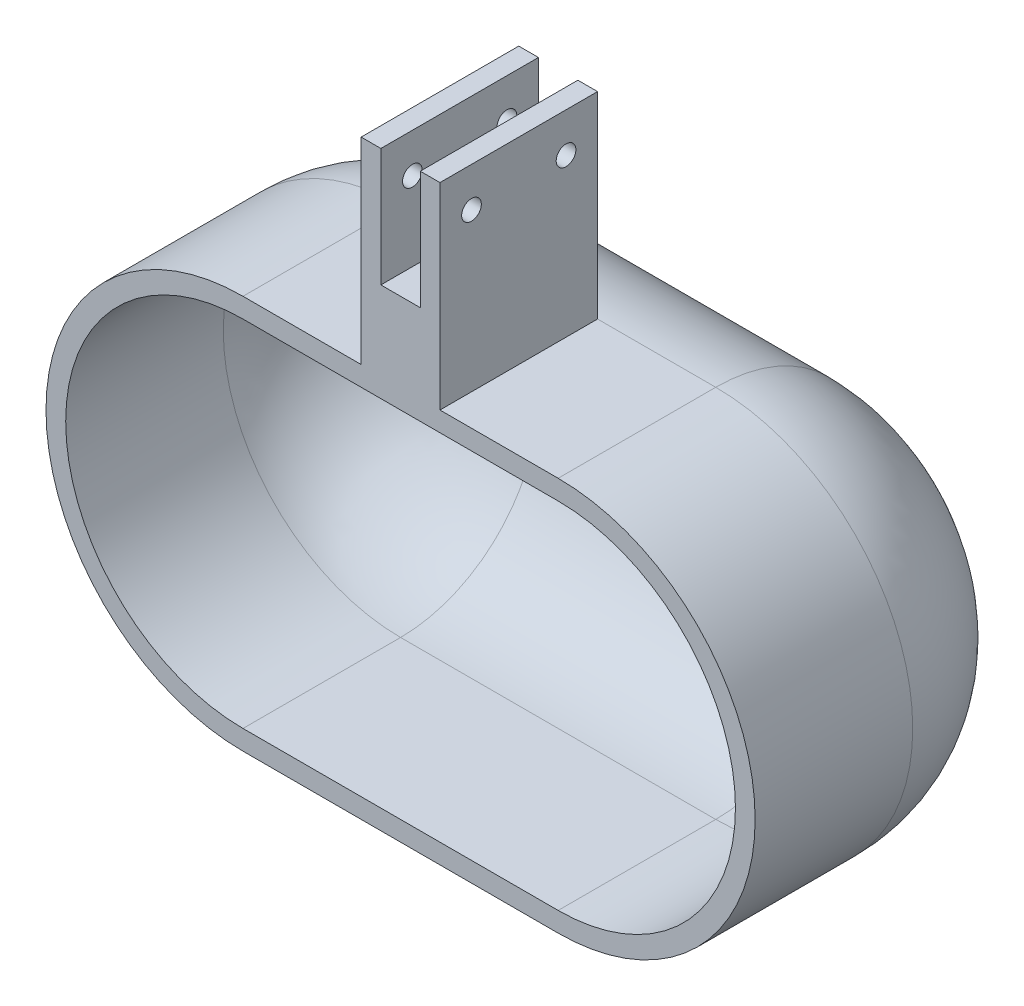
ISO-10303-21;
HEADER;
FILE_DESCRIPTION(('STEP AP214'),'2;1');
FILE_NAME('part.step','',(''),(''),'','','');
FILE_SCHEMA(('AUTOMOTIVE_DESIGN { 1 0 10303 214 1 1 1 1 }'));
ENDSEC;
DATA;
#1=APPLICATION_CONTEXT('core data for automotive mechanical design processes');
#2=APPLICATION_PROTOCOL_DEFINITION('international standard','automotive_design',2000,#1);
#3=PRODUCT_CONTEXT('',#1,'mechanical');
#4=PRODUCT('Part','Part','',(#3));
#5=PRODUCT_RELATED_PRODUCT_CATEGORY('part','',(#4));
#6=PRODUCT_DEFINITION_FORMATION('','',#4);
#7=PRODUCT_DEFINITION_CONTEXT('part definition',#1,'design');
#8=PRODUCT_DEFINITION('design','',#6,#7);
#9=PRODUCT_DEFINITION_SHAPE('','',#8);
#10=(LENGTH_UNIT() NAMED_UNIT(*) SI_UNIT(.MILLI.,.METRE.));
#11=(NAMED_UNIT(*) PLANE_ANGLE_UNIT() SI_UNIT($,.RADIAN.));
#12=(NAMED_UNIT(*) SI_UNIT($,.STERADIAN.) SOLID_ANGLE_UNIT());
#13=UNCERTAINTY_MEASURE_WITH_UNIT(LENGTH_MEASURE(1.E-05),#10,'distance_accuracy_value','');
#14=(GEOMETRIC_REPRESENTATION_CONTEXT(3) GLOBAL_UNCERTAINTY_ASSIGNED_CONTEXT((#13)) GLOBAL_UNIT_ASSIGNED_CONTEXT((#10,
#11,#12)) REPRESENTATION_CONTEXT('',''));
#15=CARTESIAN_POINT('',(0.,0.,0.));
#16=DIRECTION('',(0.,0.,1.));
#17=DIRECTION('',(1.,0.,0.));
#18=AXIS2_PLACEMENT_3D('',#15,#16,#17);
#19=CARTESIAN_POINT('',(0.,0.,80.));
#20=DIRECTION('',(0.,0.,1.));
#21=DIRECTION('',(1.,0.,0.));
#22=AXIS2_PLACEMENT_3D('',#19,#20,#21);
#23=PLANE('',#22);
#24=CARTESIAN_POINT('',(0.,0.,80.));
#25=DIRECTION('',(0.,0.,1.));
#26=DIRECTION('',(1.,0.,0.));
#27=AXIS2_PLACEMENT_3D('',#24,#25,#26);
#28=CIRCLE('',#27,45.);
#29=CARTESIAN_POINT('',(0.,-45.,80.));
#30=VERTEX_POINT('',#29);
#31=CARTESIAN_POINT('',(0.,45.,80.));
#32=VERTEX_POINT('',#31);
#33=EDGE_CURVE('E276',#30,#32,#28,.T.);
#34=ORIENTED_EDGE('',*,*,#33,.F.);
#35=DIRECTION('',(1.,0.,0.));
#36=VECTOR('',#35,1.);
#37=CARTESIAN_POINT('',(0.,-45.,80.));
#38=LINE('',#37,#36);
#39=CARTESIAN_POINT('',(-80.,-45.,80.));
#40=VERTEX_POINT('',#39);
#41=EDGE_CURVE('E245',#40,#30,#38,.T.);
#42=ORIENTED_EDGE('',*,*,#41,.F.);
#43=CARTESIAN_POINT('',(-80.,0.,80.));
#44=DIRECTION('',(0.,0.,1.));
#45=DIRECTION('',(1.,0.,0.));
#46=AXIS2_PLACEMENT_3D('',#43,#44,#45);
#47=CIRCLE('',#46,45.);
#48=CARTESIAN_POINT('',(-80.,45.,80.));
#49=VERTEX_POINT('',#48);
#50=EDGE_CURVE('E286',#49,#40,#47,.T.);
#51=ORIENTED_EDGE('',*,*,#50,.F.);
#52=DIRECTION('',(-1.,0.,0.));
#53=VECTOR('',#52,1.);
#54=CARTESIAN_POINT('',(0.,45.,80.));
#55=LINE('',#54,#53);
#56=EDGE_CURVE('E284',#32,#49,#55,.T.);
#57=ORIENTED_EDGE('',*,*,#56,.F.);
#58=EDGE_LOOP('',(#34,#42,#51,#57));
#59=FACE_BOUND('',#58,.T.);
#60=DIRECTION('',(-1.,0.,0.));
#61=VECTOR('',#60,1.);
#62=CARTESIAN_POINT('',(-35.,70.,80.));
#63=LINE('',#62,#61);
#64=CARTESIAN_POINT('',(-35.,70.,80.));
#65=VERTEX_POINT('',#64);
#66=CARTESIAN_POINT('',(-45.,70.,80.));
#67=VERTEX_POINT('',#66);
#68=EDGE_CURVE('E192',#65,#67,#63,.T.);
#69=ORIENTED_EDGE('',*,*,#68,.T.);
#70=DIRECTION('',(0.,-1.,0.));
#71=VECTOR('',#70,1.);
#72=CARTESIAN_POINT('',(-45.,100.000012,80.));
#73=LINE('',#72,#71);
#74=CARTESIAN_POINT('',(-45.,100.,80.));
#75=VERTEX_POINT('',#74);
#76=EDGE_CURVE('E177',#75,#67,#73,.T.);
#77=ORIENTED_EDGE('',*,*,#76,.F.);
#78=DIRECTION('',(1.,0.,0.));
#79=VECTOR('',#78,1.);
#80=CARTESIAN_POINT('',(-30.,100.,80.));
#81=LINE('',#80,#79);
#82=CARTESIAN_POINT('',(-50.,100.,80.));
#83=VERTEX_POINT('',#82);
#84=EDGE_CURVE('E220',#83,#75,#81,.T.);
#85=ORIENTED_EDGE('',*,*,#84,.F.);
#86=DIRECTION('',(0.,-1.,0.));
#87=VECTOR('',#86,1.);
#88=CARTESIAN_POINT('',(-50.,100.,80.));
#89=LINE('',#88,#87);
#90=CARTESIAN_POINT('',(-50.,50.,80.));
#91=VERTEX_POINT('',#90);
#92=EDGE_CURVE('E231',#83,#91,#89,.T.);
#93=ORIENTED_EDGE('',*,*,#92,.T.);
#94=DIRECTION('',(-1.,0.,0.));
#95=VECTOR('',#94,1.);
#96=CARTESIAN_POINT('',(0.,50.,80.));
#97=LINE('',#96,#95);
#98=CARTESIAN_POINT('',(-80.,50.,80.));
#99=VERTEX_POINT('',#98);
#100=EDGE_CURVE('E62',#91,#99,#97,.T.);
#101=ORIENTED_EDGE('',*,*,#100,.T.);
#102=CARTESIAN_POINT('',(-80.,0.,80.));
#103=DIRECTION('',(0.,0.,1.));
#104=DIRECTION('',(1.,0.,0.));
#105=AXIS2_PLACEMENT_3D('',#102,#103,#104);
#106=CIRCLE('',#105,50.);
#107=CARTESIAN_POINT('',(-80.,-50.,80.));
#108=VERTEX_POINT('',#107);
#109=EDGE_CURVE('E297',#99,#108,#106,.T.);
#110=ORIENTED_EDGE('',*,*,#109,.T.);
#111=DIRECTION('',(1.,0.,0.));
#112=VECTOR('',#111,1.);
#113=CARTESIAN_POINT('',(0.,-50.,80.));
#114=LINE('',#113,#112);
#115=CARTESIAN_POINT('',(0.,-50.,80.));
#116=VERTEX_POINT('',#115);
#117=EDGE_CURVE('E299',#108,#116,#114,.T.);
#118=ORIENTED_EDGE('',*,*,#117,.T.);
#119=CARTESIAN_POINT('',(0.,0.,80.));
#120=DIRECTION('',(0.,0.,1.));
#121=DIRECTION('',(1.,0.,0.));
#122=AXIS2_PLACEMENT_3D('',#119,#120,#121);
#123=CIRCLE('',#122,50.);
#124=CARTESIAN_POINT('',(0.,50.,80.));
#125=VERTEX_POINT('',#124);
#126=EDGE_CURVE('E290',#116,#125,#123,.T.);
#127=ORIENTED_EDGE('',*,*,#126,.T.);
#128=CARTESIAN_POINT('',(-30.,50.,80.));
#129=VERTEX_POINT('',#128);
#130=EDGE_CURVE('E294',#125,#129,#97,.T.);
#131=ORIENTED_EDGE('',*,*,#130,.T.);
#132=DIRECTION('',(0.,-1.,0.));
#133=VECTOR('',#132,1.);
#134=CARTESIAN_POINT('',(-30.,100.,80.));
#135=LINE('',#134,#133);
#136=CARTESIAN_POINT('',(-30.,100.,80.));
#137=VERTEX_POINT('',#136);
#138=EDGE_CURVE('E222',#137,#129,#135,.T.);
#139=ORIENTED_EDGE('',*,*,#138,.F.);
#140=CARTESIAN_POINT('',(-35.,100.,80.));
#141=VERTEX_POINT('',#140);
#142=EDGE_CURVE('E219',#141,#137,#81,.T.);
#143=ORIENTED_EDGE('',*,*,#142,.F.);
#144=DIRECTION('',(0.,-1.,0.));
#145=VECTOR('',#144,1.);
#146=CARTESIAN_POINT('',(-35.,100.000012,80.));
#147=LINE('',#146,#145);
#148=EDGE_CURVE('E54',#141,#65,#147,.T.);
#149=ORIENTED_EDGE('',*,*,#148,.T.);
#150=EDGE_LOOP('',(#69,#77,#85,#93,#101,#110,#118,#127,#131,#139,#143,#149));
#151=FACE_BOUND('',#150,.T.);
#152=ADVANCED_FACE('F37',(#59,#151),#23,.T.);
#153=CARTESIAN_POINT('',(-30.,100.,40.));
#154=DIRECTION('',(0.,0.,1.));
#155=DIRECTION('',(1.,0.,0.));
#156=AXIS2_PLACEMENT_3D('',#153,#154,#155);
#157=PLANE('',#156);
#158=DIRECTION('',(0.,-1.,0.));
#159=VECTOR('',#158,1.);
#160=CARTESIAN_POINT('',(-45.,100.000012,40.));
#161=LINE('',#160,#159);
#162=CARTESIAN_POINT('',(-45.,100.,40.));
#163=VERTEX_POINT('',#162);
#164=CARTESIAN_POINT('',(-45.,70.,40.));
#165=VERTEX_POINT('',#164);
#166=EDGE_CURVE('E204',#163,#165,#161,.T.);
#167=ORIENTED_EDGE('',*,*,#166,.T.);
#168=DIRECTION('',(1.,0.,0.));
#169=VECTOR('',#168,1.);
#170=CARTESIAN_POINT('',(-45.,70.,40.));
#171=LINE('',#170,#169);
#172=CARTESIAN_POINT('',(-35.,70.,40.));
#173=VERTEX_POINT('',#172);
#174=EDGE_CURVE('E194',#165,#173,#171,.T.);
#175=ORIENTED_EDGE('',*,*,#174,.T.);
#176=DIRECTION('',(0.,-1.,0.));
#177=VECTOR('',#176,1.);
#178=CARTESIAN_POINT('',(-35.,100.000012,40.));
#179=LINE('',#178,#177);
#180=CARTESIAN_POINT('',(-35.,100.,40.));
#181=VERTEX_POINT('',#180);
#182=EDGE_CURVE('E206',#181,#173,#179,.T.);
#183=ORIENTED_EDGE('',*,*,#182,.F.);
#184=DIRECTION('',(-1.,0.,0.));
#185=VECTOR('',#184,1.);
#186=CARTESIAN_POINT('',(-30.,100.,40.));
#187=LINE('',#186,#185);
#188=CARTESIAN_POINT('',(-30.,100.,40.));
#189=VERTEX_POINT('',#188);
#190=EDGE_CURVE('E214',#189,#181,#187,.T.);
#191=ORIENTED_EDGE('',*,*,#190,.F.);
#192=DIRECTION('',(0.,-1.,0.));
#193=VECTOR('',#192,1.);
#194=CARTESIAN_POINT('',(-30.,100.,40.));
#195=LINE('',#194,#193);
#196=CARTESIAN_POINT('',(-30.,50.,40.));
#197=VERTEX_POINT('',#196);
#198=EDGE_CURVE('E237',#189,#197,#195,.T.);
#199=ORIENTED_EDGE('',*,*,#198,.T.);
#200=DIRECTION('',(-1.,0.,0.));
#201=VECTOR('',#200,1.);
#202=CARTESIAN_POINT('',(-30.,50.,40.));
#203=LINE('',#202,#201);
#204=CARTESIAN_POINT('',(-50.,50.,40.));
#205=VERTEX_POINT('',#204);
#206=EDGE_CURVE('E225',#197,#205,#203,.T.);
#207=ORIENTED_EDGE('',*,*,#206,.T.);
#208=DIRECTION('',(0.,-1.,0.));
#209=VECTOR('',#208,1.);
#210=CARTESIAN_POINT('',(-50.,100.,40.));
#211=LINE('',#210,#209);
#212=CARTESIAN_POINT('',(-50.,100.,40.));
#213=VERTEX_POINT('',#212);
#214=EDGE_CURVE('E234',#213,#205,#211,.T.);
#215=ORIENTED_EDGE('',*,*,#214,.F.);
#216=EDGE_CURVE('E212',#163,#213,#187,.T.);
#217=ORIENTED_EDGE('',*,*,#216,.F.);
#218=EDGE_LOOP('',(#167,#175,#183,#191,#199,#207,#215,#217));
#219=FACE_BOUND('',#218,.T.);
#220=ADVANCED_FACE('F382',(#219),#157,.F.);
#221=CARTESIAN_POINT('',(0.,100.,0.));
#222=DIRECTION('',(0.,1.,0.));
#223=DIRECTION('',(-1.,0.,0.));
#224=AXIS2_PLACEMENT_3D('',#221,#222,#223);
#225=PLANE('',#224);
#226=ORIENTED_EDGE('',*,*,#84,.T.);
#227=DIRECTION('',(0.,0.,-1.));
#228=VECTOR('',#227,1.);
#229=CARTESIAN_POINT('',(-45.,100.,0.));
#230=LINE('',#229,#228);
#231=EDGE_CURVE('E11',#75,#163,#230,.T.);
#232=ORIENTED_EDGE('',*,*,#231,.T.);
#233=ORIENTED_EDGE('',*,*,#216,.T.);
#234=DIRECTION('',(0.,0.,1.));
#235=VECTOR('',#234,1.);
#236=CARTESIAN_POINT('',(-50.,100.,80.));
#237=LINE('',#236,#235);
#238=EDGE_CURVE('E217',#213,#83,#237,.T.);
#239=ORIENTED_EDGE('',*,*,#238,.T.);
#240=EDGE_LOOP('',(#226,#232,#233,#239));
#241=FACE_BOUND('',#240,.T.);
#242=ADVANCED_FACE('F388',(#241),#225,.T.);
#243=CARTESIAN_POINT('',(0.,50.,80.));
#244=DIRECTION('',(0.,-1.,0.));
#245=DIRECTION('',(1.,0.,0.));
#246=AXIS2_PLACEMENT_3D('',#243,#244,#245);
#247=PLANE('',#246);
#248=DIRECTION('',(0.,0.,-1.));
#249=VECTOR('',#248,1.);
#250=CARTESIAN_POINT('',(-30.,50.,80.));
#251=LINE('',#250,#249);
#252=EDGE_CURVE('E186',#129,#197,#251,.T.);
#253=ORIENTED_EDGE('',*,*,#252,.F.);
#254=ORIENTED_EDGE('',*,*,#130,.F.);
#255=DIRECTION('',(0.,0.,-1.));
#256=VECTOR('',#255,1.);
#257=CARTESIAN_POINT('',(0.,50.,80.));
#258=LINE('',#257,#256);
#259=CARTESIAN_POINT('',(0.,50.,40.));
#260=VERTEX_POINT('',#259);
#261=EDGE_CURVE('E310',#125,#260,#258,.T.);
#262=ORIENTED_EDGE('',*,*,#261,.T.);
#263=DIRECTION('',(-1.,0.,0.));
#264=VECTOR('',#263,1.);
#265=CARTESIAN_POINT('',(0.,50.,40.));
#266=LINE('',#265,#264);
#267=EDGE_CURVE('E314',#260,#197,#266,.T.);
#268=ORIENTED_EDGE('',*,*,#267,.T.);
#269=EDGE_LOOP('',(#253,#254,#262,#268));
#270=FACE_BOUND('',#269,.T.);
#271=ADVANCED_FACE('F409',(#270),#247,.F.);
#272=DIRECTION('',(0.,0.,1.));
#273=VECTOR('',#272,1.);
#274=CARTESIAN_POINT('',(-50.,50.,80.));
#275=LINE('',#274,#273);
#276=EDGE_CURVE('E213',#205,#91,#275,.T.);
#277=ORIENTED_EDGE('',*,*,#276,.F.);
#278=CARTESIAN_POINT('',(-80.,50.,40.));
#279=VERTEX_POINT('',#278);
#280=EDGE_CURVE('E313',#205,#279,#266,.T.);
#281=ORIENTED_EDGE('',*,*,#280,.T.);
#282=DIRECTION('',(0.,0.,-1.));
#283=VECTOR('',#282,1.);
#284=CARTESIAN_POINT('',(-80.,50.,80.));
#285=LINE('',#284,#283);
#286=EDGE_CURVE('E307',#99,#279,#285,.T.);
#287=ORIENTED_EDGE('',*,*,#286,.F.);
#288=ORIENTED_EDGE('',*,*,#100,.F.);
#289=EDGE_LOOP('',(#277,#281,#287,#288));
#290=FACE_BOUND('',#289,.T.);
#291=ADVANCED_FACE('F412',(#290),#247,.F.);
#292=CARTESIAN_POINT('',(0.,0.,80.));
#293=DIRECTION('',(0.,0.,-1.));
#294=DIRECTION('',(-1.,0.,0.));
#295=AXIS2_PLACEMENT_3D('',#292,#293,#294);
#296=CYLINDRICAL_SURFACE('',#295,50.);
#297=DIRECTION('',(0.,0.,-1.));
#298=VECTOR('',#297,1.);
#299=CARTESIAN_POINT('',(0.,-50.,80.));
#300=LINE('',#299,#298);
#301=CARTESIAN_POINT('',(0.,-50.,40.));
#302=VERTEX_POINT('',#301);
#303=EDGE_CURVE('E301',#116,#302,#300,.T.);
#304=ORIENTED_EDGE('',*,*,#303,.T.);
#305=CARTESIAN_POINT('',(0.,0.,40.));
#306=DIRECTION('',(0.,0.,1.));
#307=DIRECTION('',(1.,0.,0.));
#308=AXIS2_PLACEMENT_3D('',#305,#306,#307);
#309=CIRCLE('',#308,50.);
#310=EDGE_CURVE('E330',#302,#260,#309,.T.);
#311=ORIENTED_EDGE('',*,*,#310,.T.);
#312=ORIENTED_EDGE('',*,*,#261,.F.);
#313=ORIENTED_EDGE('',*,*,#126,.F.);
#314=EDGE_LOOP('',(#304,#311,#312,#313));
#315=FACE_BOUND('',#314,.T.);
#316=ADVANCED_FACE('F407',(#315),#296,.T.);
#317=CARTESIAN_POINT('',(-80.,0.,80.));
#318=DIRECTION('',(0.,0.,-1.));
#319=DIRECTION('',(-1.,0.,0.));
#320=AXIS2_PLACEMENT_3D('',#317,#318,#319);
#321=CYLINDRICAL_SURFACE('',#320,50.);
#322=ORIENTED_EDGE('',*,*,#286,.T.);
#323=CARTESIAN_POINT('',(-80.,0.,40.));
#324=DIRECTION('',(0.,0.,1.));
#325=DIRECTION('',(1.,0.,0.));
#326=AXIS2_PLACEMENT_3D('',#323,#324,#325);
#327=CIRCLE('',#326,50.);
#328=CARTESIAN_POINT('',(-80.,-50.,40.));
#329=VERTEX_POINT('',#328);
#330=EDGE_CURVE('E326',#279,#329,#327,.T.);
#331=ORIENTED_EDGE('',*,*,#330,.T.);
#332=DIRECTION('',(0.,0.,-1.));
#333=VECTOR('',#332,1.);
#334=CARTESIAN_POINT('',(-80.,-50.,80.));
#335=LINE('',#334,#333);
#336=EDGE_CURVE('E304',#108,#329,#335,.T.);
#337=ORIENTED_EDGE('',*,*,#336,.F.);
#338=ORIENTED_EDGE('',*,*,#109,.F.);
#339=EDGE_LOOP('',(#322,#331,#337,#338));
#340=FACE_BOUND('',#339,.T.);
#341=ADVANCED_FACE('F403',(#340),#321,.T.);
#342=CARTESIAN_POINT('',(0.,-50.,80.));
#343=DIRECTION('',(0.,1.,0.));
#344=DIRECTION('',(-1.,0.,0.));
#345=AXIS2_PLACEMENT_3D('',#342,#343,#344);
#346=PLANE('',#345);
#347=ORIENTED_EDGE('',*,*,#336,.T.);
#348=DIRECTION('',(1.,0.,0.));
#349=VECTOR('',#348,1.);
#350=CARTESIAN_POINT('',(0.,-50.,40.));
#351=LINE('',#350,#349);
#352=EDGE_CURVE('E328',#329,#302,#351,.T.);
#353=ORIENTED_EDGE('',*,*,#352,.T.);
#354=ORIENTED_EDGE('',*,*,#303,.F.);
#355=ORIENTED_EDGE('',*,*,#117,.F.);
#356=EDGE_LOOP('',(#347,#353,#354,#355));
#357=FACE_BOUND('',#356,.T.);
#358=ADVANCED_FACE('F399',(#357),#346,.F.);
#359=CARTESIAN_POINT('',(0.,0.,0.));
#360=DIRECTION('',(0.,0.,1.));
#361=DIRECTION('',(1.,0.,0.));
#362=AXIS2_PLACEMENT_3D('',#359,#360,#361);
#363=PLANE('',#362);
#364=CARTESIAN_POINT('',(-80.,0.,0.));
#365=DIRECTION('',(0.,0.,1.));
#366=DIRECTION('',(1.,0.,0.));
#367=AXIS2_PLACEMENT_3D('',#364,#365,#366);
#368=CIRCLE('',#367,10.);
#369=CARTESIAN_POINT('',(-80.,-10.,0.));
#370=VERTEX_POINT('',#369);
#371=CARTESIAN_POINT('',(-80.,9.99999999999999,0.));
#372=VERTEX_POINT('',#371);
#373=EDGE_CURVE('E321',#370,#372,#368,.F.);
#374=ORIENTED_EDGE('',*,*,#373,.T.);
#375=DIRECTION('',(-1.,0.,0.));
#376=VECTOR('',#375,1.);
#377=CARTESIAN_POINT('',(0.,10.,0.));
#378=LINE('',#377,#376);
#379=CARTESIAN_POINT('',(0.,10.,0.));
#380=VERTEX_POINT('',#379);
#381=EDGE_CURVE('E323',#372,#380,#378,.F.);
#382=ORIENTED_EDGE('',*,*,#381,.T.);
#383=CARTESIAN_POINT('',(0.,0.,0.));
#384=DIRECTION('',(0.,0.,1.));
#385=DIRECTION('',(1.,0.,0.));
#386=AXIS2_PLACEMENT_3D('',#383,#384,#385);
#387=CIRCLE('',#386,10.);
#388=CARTESIAN_POINT('',(0.,-10.,0.));
#389=VERTEX_POINT('',#388);
#390=EDGE_CURVE('E317',#380,#389,#387,.F.);
#391=ORIENTED_EDGE('',*,*,#390,.T.);
#392=DIRECTION('',(1.,0.,0.));
#393=VECTOR('',#392,1.);
#394=CARTESIAN_POINT('',(0.,-10.,0.));
#395=LINE('',#394,#393);
#396=EDGE_CURVE('E319',#389,#370,#395,.F.);
#397=ORIENTED_EDGE('',*,*,#396,.T.);
#398=EDGE_LOOP('',(#374,#382,#391,#397));
#399=FACE_BOUND('',#398,.T.);
#400=ADVANCED_FACE('F396',(#399),#363,.F.);
#401=CARTESIAN_POINT('',(0.,-10.,40.));
#402=DIRECTION('',(1.,0.,0.));
#403=DIRECTION('',(0.,1.,0.));
#404=AXIS2_PLACEMENT_3D('',#401,#402,#403);
#405=CYLINDRICAL_SURFACE('',#404,40.);
#406=CARTESIAN_POINT('',(-80.,-10.,40.));
#407=DIRECTION('',(-1.,0.,0.));
#408=DIRECTION('',(0.,0.,1.));
#409=AXIS2_PLACEMENT_3D('',#406,#407,#408);
#410=CIRCLE('',#409,40.);
#411=EDGE_CURVE('E336',#370,#329,#410,.T.);
#412=ORIENTED_EDGE('',*,*,#411,.F.);
#413=ORIENTED_EDGE('',*,*,#396,.F.);
#414=CARTESIAN_POINT('',(0.,-10.,40.));
#415=DIRECTION('',(1.,0.,0.));
#416=DIRECTION('',(0.,1.,0.));
#417=AXIS2_PLACEMENT_3D('',#414,#415,#416);
#418=CIRCLE('',#417,40.);
#419=EDGE_CURVE('E293',#302,#389,#418,.T.);
#420=ORIENTED_EDGE('',*,*,#419,.F.);
#421=ORIENTED_EDGE('',*,*,#352,.F.);
#422=EDGE_LOOP('',(#412,#413,#420,#421));
#423=FACE_BOUND('',#422,.T.);
#424=ADVANCED_FACE('F39',(#423),#405,.T.);
#425=CARTESIAN_POINT('',(0.,0.,40.));
#426=DIRECTION('',(0.,0.,1.));
#427=DIRECTION('',(1.,0.,0.));
#428=AXIS2_PLACEMENT_3D('',#425,#426,#427);
#429=DEGENERATE_TOROIDAL_SURFACE('',#428,10.,40.,.T.);
#430=ORIENTED_EDGE('',*,*,#419,.T.);
#431=ORIENTED_EDGE('',*,*,#390,.F.);
#432=CARTESIAN_POINT('',(0.,10.,40.));
#433=DIRECTION('',(-1.,0.,0.));
#434=DIRECTION('',(0.,0.,1.));
#435=AXIS2_PLACEMENT_3D('',#432,#433,#434);
#436=CIRCLE('',#435,40.);
#437=EDGE_CURVE('E334',#260,#380,#436,.T.);
#438=ORIENTED_EDGE('',*,*,#437,.F.);
#439=ORIENTED_EDGE('',*,*,#310,.F.);
#440=EDGE_LOOP('',(#430,#431,#438,#439));
#441=FACE_BOUND('',#440,.T.);
#442=ADVANCED_FACE('F424',(#441),#429,.T.);
#443=CARTESIAN_POINT('',(-80.,0.,40.));
#444=DIRECTION('',(0.,0.,1.));
#445=DIRECTION('',(1.,0.,0.));
#446=AXIS2_PLACEMENT_3D('',#443,#444,#445);
#447=DEGENERATE_TOROIDAL_SURFACE('',#446,10.,40.,.T.);
#448=ORIENTED_EDGE('',*,*,#411,.T.);
#449=ORIENTED_EDGE('',*,*,#330,.F.);
#450=CARTESIAN_POINT('',(-80.,9.99999999999999,40.));
#451=DIRECTION('',(1.,0.,0.));
#452=DIRECTION('',(0.,0.,-1.));
#453=AXIS2_PLACEMENT_3D('',#450,#451,#452);
#454=CIRCLE('',#453,40.);
#455=EDGE_CURVE('E248',#372,#279,#454,.T.);
#456=ORIENTED_EDGE('',*,*,#455,.F.);
#457=ORIENTED_EDGE('',*,*,#373,.F.);
#458=EDGE_LOOP('',(#448,#449,#456,#457));
#459=FACE_BOUND('',#458,.T.);
#460=ADVANCED_FACE('F421',(#459),#447,.T.);
#461=CARTESIAN_POINT('',(0.,10.,40.));
#462=DIRECTION('',(-1.,0.,0.));
#463=DIRECTION('',(0.,-1.,0.));
#464=AXIS2_PLACEMENT_3D('',#461,#462,#463);
#465=CYLINDRICAL_SURFACE('',#464,40.);
#466=ORIENTED_EDGE('',*,*,#437,.T.);
#467=ORIENTED_EDGE('',*,*,#381,.F.);
#468=ORIENTED_EDGE('',*,*,#455,.T.);
#469=ORIENTED_EDGE('',*,*,#280,.F.);
#470=ORIENTED_EDGE('',*,*,#206,.F.);
#471=ORIENTED_EDGE('',*,*,#267,.F.);
#472=EDGE_LOOP('',(#466,#467,#468,#469,#470,#471));
#473=FACE_BOUND('',#472,.T.);
#474=ADVANCED_FACE('F417',(#473),#465,.T.);
#475=CARTESIAN_POINT('',(0.,0.,80.));
#476=DIRECTION('',(0.,0.,-1.));
#477=DIRECTION('',(-1.,0.,0.));
#478=AXIS2_PLACEMENT_3D('',#475,#476,#477);
#479=CYLINDRICAL_SURFACE('',#478,45.);
#480=DIRECTION('',(0.,0.,-1.));
#481=VECTOR('',#480,1.);
#482=CARTESIAN_POINT('',(0.,-45.,80.));
#483=LINE('',#482,#481);
#484=CARTESIAN_POINT('',(0.,-45.,40.));
#485=VERTEX_POINT('',#484);
#486=EDGE_CURVE('E241',#30,#485,#483,.T.);
#487=ORIENTED_EDGE('',*,*,#486,.F.);
#488=ORIENTED_EDGE('',*,*,#33,.T.);
#489=DIRECTION('',(0.,0.,1.));
#490=VECTOR('',#489,1.);
#491=CARTESIAN_POINT('',(0.,45.,80.));
#492=LINE('',#491,#490);
#493=CARTESIAN_POINT('',(0.,45.,40.));
#494=VERTEX_POINT('',#493);
#495=EDGE_CURVE('E250',#32,#494,#492,.F.);
#496=ORIENTED_EDGE('',*,*,#495,.T.);
#497=CARTESIAN_POINT('',(0.,0.,40.));
#498=DIRECTION('',(0.,0.,-1.));
#499=DIRECTION('',(-1.,0.,0.));
#500=AXIS2_PLACEMENT_3D('',#497,#498,#499);
#501=CIRCLE('',#500,45.);
#502=EDGE_CURVE('E246',#485,#494,#501,.F.);
#503=ORIENTED_EDGE('',*,*,#502,.F.);
#504=EDGE_LOOP('',(#487,#488,#496,#503));
#505=FACE_BOUND('',#504,.T.);
#506=ADVANCED_FACE('F420',(#505),#479,.F.);
#507=CARTESIAN_POINT('',(0.,45.,80.));
#508=DIRECTION('',(0.,-1.,0.));
#509=DIRECTION('',(1.,0.,0.));
#510=AXIS2_PLACEMENT_3D('',#507,#508,#509);
#511=PLANE('',#510);
#512=ORIENTED_EDGE('',*,*,#495,.F.);
#513=ORIENTED_EDGE('',*,*,#56,.T.);
#514=DIRECTION('',(0.,0.,-1.));
#515=VECTOR('',#514,1.);
#516=CARTESIAN_POINT('',(-80.,45.,80.));
#517=LINE('',#516,#515);
#518=CARTESIAN_POINT('',(-80.,45.,40.));
#519=VERTEX_POINT('',#518);
#520=EDGE_CURVE('E254',#49,#519,#517,.T.);
#521=ORIENTED_EDGE('',*,*,#520,.T.);
#522=DIRECTION('',(1.,0.,0.));
#523=VECTOR('',#522,1.);
#524=CARTESIAN_POINT('',(0.,45.,40.));
#525=LINE('',#524,#523);
#526=EDGE_CURVE('E253',#494,#519,#525,.F.);
#527=ORIENTED_EDGE('',*,*,#526,.F.);
#528=EDGE_LOOP('',(#512,#513,#521,#527));
#529=FACE_BOUND('',#528,.T.);
#530=ADVANCED_FACE('F507',(#529),#511,.T.);
#531=CARTESIAN_POINT('',(-80.,0.,80.));
#532=DIRECTION('',(0.,0.,-1.));
#533=DIRECTION('',(-1.,0.,0.));
#534=AXIS2_PLACEMENT_3D('',#531,#532,#533);
#535=CYLINDRICAL_SURFACE('',#534,45.);
#536=ORIENTED_EDGE('',*,*,#520,.F.);
#537=ORIENTED_EDGE('',*,*,#50,.T.);
#538=DIRECTION('',(0.,0.,1.));
#539=VECTOR('',#538,1.);
#540=CARTESIAN_POINT('',(-80.,-45.,80.));
#541=LINE('',#540,#539);
#542=CARTESIAN_POINT('',(-80.,-45.,40.));
#543=VERTEX_POINT('',#542);
#544=EDGE_CURVE('E244',#40,#543,#541,.F.);
#545=ORIENTED_EDGE('',*,*,#544,.T.);
#546=CARTESIAN_POINT('',(-80.,0.,40.));
#547=DIRECTION('',(0.,0.,-1.));
#548=DIRECTION('',(-1.,0.,0.));
#549=AXIS2_PLACEMENT_3D('',#546,#547,#548);
#550=CIRCLE('',#549,45.);
#551=EDGE_CURVE('E260',#519,#543,#550,.F.);
#552=ORIENTED_EDGE('',*,*,#551,.F.);
#553=EDGE_LOOP('',(#536,#537,#545,#552));
#554=FACE_BOUND('',#553,.T.);
#555=ADVANCED_FACE('F511',(#554),#535,.F.);
#556=CARTESIAN_POINT('',(0.,-45.,80.));
#557=DIRECTION('',(0.,1.,0.));
#558=DIRECTION('',(-1.,0.,0.));
#559=AXIS2_PLACEMENT_3D('',#556,#557,#558);
#560=PLANE('',#559);
#561=ORIENTED_EDGE('',*,*,#544,.F.);
#562=ORIENTED_EDGE('',*,*,#41,.T.);
#563=ORIENTED_EDGE('',*,*,#486,.T.);
#564=DIRECTION('',(-1.,0.,0.));
#565=VECTOR('',#564,1.);
#566=CARTESIAN_POINT('',(0.,-45.,40.));
#567=LINE('',#566,#565);
#568=EDGE_CURVE('E249',#543,#485,#567,.F.);
#569=ORIENTED_EDGE('',*,*,#568,.F.);
#570=EDGE_LOOP('',(#561,#562,#563,#569));
#571=FACE_BOUND('',#570,.T.);
#572=ADVANCED_FACE('F515',(#571),#560,.T.);
#573=CARTESIAN_POINT('',(0.,0.,5.));
#574=DIRECTION('',(0.,0.,1.));
#575=DIRECTION('',(1.,0.,0.));
#576=AXIS2_PLACEMENT_3D('',#573,#574,#575);
#577=PLANE('',#576);
#578=CARTESIAN_POINT('',(-80.,0.,5.));
#579=DIRECTION('',(0.,0.,1.));
#580=DIRECTION('',(1.,0.,0.));
#581=AXIS2_PLACEMENT_3D('',#578,#579,#580);
#582=CIRCLE('',#581,10.);
#583=CARTESIAN_POINT('',(-80.,-10.,5.));
#584=VERTEX_POINT('',#583);
#585=CARTESIAN_POINT('',(-80.,9.99999999999999,5.));
#586=VERTEX_POINT('',#585);
#587=EDGE_CURVE('E273',#584,#586,#582,.F.);
#588=ORIENTED_EDGE('',*,*,#587,.F.);
#589=DIRECTION('',(1.,0.,0.));
#590=VECTOR('',#589,1.);
#591=CARTESIAN_POINT('',(0.,-10.,5.));
#592=LINE('',#591,#590);
#593=CARTESIAN_POINT('',(0.,-10.,5.));
#594=VERTEX_POINT('',#593);
#595=EDGE_CURVE('E271',#594,#584,#592,.F.);
#596=ORIENTED_EDGE('',*,*,#595,.F.);
#597=CARTESIAN_POINT('',(0.,0.,5.));
#598=DIRECTION('',(0.,0.,1.));
#599=DIRECTION('',(1.,0.,0.));
#600=AXIS2_PLACEMENT_3D('',#597,#598,#599);
#601=CIRCLE('',#600,10.);
#602=CARTESIAN_POINT('',(0.,10.,5.));
#603=VERTEX_POINT('',#602);
#604=EDGE_CURVE('E257',#603,#594,#601,.F.);
#605=ORIENTED_EDGE('',*,*,#604,.F.);
#606=DIRECTION('',(1.,0.,0.));
#607=VECTOR('',#606,1.);
#608=CARTESIAN_POINT('',(0.,9.99999999999999,5.));
#609=LINE('',#608,#607);
#610=EDGE_CURVE('E262',#586,#603,#609,.T.);
#611=ORIENTED_EDGE('',*,*,#610,.F.);
#612=EDGE_LOOP('',(#588,#596,#605,#611));
#613=FACE_BOUND('',#612,.T.);
#614=ADVANCED_FACE('F519',(#613),#577,.T.);
#615=CARTESIAN_POINT('',(0.,-10.,40.));
#616=DIRECTION('',(1.,0.,0.));
#617=DIRECTION('',(0.,1.,0.));
#618=AXIS2_PLACEMENT_3D('',#615,#616,#617);
#619=CYLINDRICAL_SURFACE('',#618,35.);
#620=CARTESIAN_POINT('',(-80.,-10.,40.));
#621=DIRECTION('',(-1.,0.,0.));
#622=DIRECTION('',(0.,-1.,0.));
#623=AXIS2_PLACEMENT_3D('',#620,#621,#622);
#624=CIRCLE('',#623,35.);
#625=EDGE_CURVE('E266',#584,#543,#624,.T.);
#626=ORIENTED_EDGE('',*,*,#625,.T.);
#627=ORIENTED_EDGE('',*,*,#568,.T.);
#628=CARTESIAN_POINT('',(0.,-10.,40.));
#629=DIRECTION('',(-1.,0.,0.));
#630=DIRECTION('',(0.,-1.,0.));
#631=AXIS2_PLACEMENT_3D('',#628,#629,#630);
#632=CIRCLE('',#631,35.);
#633=EDGE_CURVE('E269',#485,#594,#632,.F.);
#634=ORIENTED_EDGE('',*,*,#633,.T.);
#635=ORIENTED_EDGE('',*,*,#595,.T.);
#636=EDGE_LOOP('',(#626,#627,#634,#635));
#637=FACE_BOUND('',#636,.T.);
#638=ADVANCED_FACE('F523',(#637),#619,.F.);
#639=CARTESIAN_POINT('',(0.,0.,40.));
#640=DIRECTION('',(0.,0.,1.));
#641=DIRECTION('',(1.,0.,0.));
#642=AXIS2_PLACEMENT_3D('',#639,#640,#641);
#643=DEGENERATE_TOROIDAL_SURFACE('',#642,10.,35.,.T.);
#644=ORIENTED_EDGE('',*,*,#633,.F.);
#645=ORIENTED_EDGE('',*,*,#502,.T.);
#646=CARTESIAN_POINT('',(0.,10.,40.));
#647=DIRECTION('',(-1.,0.,0.));
#648=DIRECTION('',(0.,-1.,0.));
#649=AXIS2_PLACEMENT_3D('',#646,#647,#648);
#650=CIRCLE('',#649,35.);
#651=EDGE_CURVE('E270',#494,#603,#650,.T.);
#652=ORIENTED_EDGE('',*,*,#651,.T.);
#653=ORIENTED_EDGE('',*,*,#604,.T.);
#654=EDGE_LOOP('',(#644,#645,#652,#653));
#655=FACE_BOUND('',#654,.T.);
#656=ADVANCED_FACE('F527',(#655),#643,.F.);
#657=CARTESIAN_POINT('',(-80.,0.,40.));
#658=DIRECTION('',(0.,0.,1.));
#659=DIRECTION('',(1.,0.,0.));
#660=AXIS2_PLACEMENT_3D('',#657,#658,#659);
#661=DEGENERATE_TOROIDAL_SURFACE('',#660,10.,35.,.T.);
#662=ORIENTED_EDGE('',*,*,#625,.F.);
#663=ORIENTED_EDGE('',*,*,#587,.T.);
#664=CARTESIAN_POINT('',(-80.,9.99999999999999,40.));
#665=DIRECTION('',(-1.,0.,0.));
#666=DIRECTION('',(0.,-1.,0.));
#667=AXIS2_PLACEMENT_3D('',#664,#665,#666);
#668=CIRCLE('',#667,35.);
#669=EDGE_CURVE('E240',#586,#519,#668,.F.);
#670=ORIENTED_EDGE('',*,*,#669,.T.);
#671=ORIENTED_EDGE('',*,*,#551,.T.);
#672=EDGE_LOOP('',(#662,#663,#670,#671));
#673=FACE_BOUND('',#672,.T.);
#674=ADVANCED_FACE('F502',(#673),#661,.F.);
#675=CARTESIAN_POINT('',(0.,10.,40.));
#676=DIRECTION('',(-1.,0.,0.));
#677=DIRECTION('',(0.,-1.,0.));
#678=AXIS2_PLACEMENT_3D('',#675,#676,#677);
#679=CYLINDRICAL_SURFACE('',#678,35.);
#680=ORIENTED_EDGE('',*,*,#651,.F.);
#681=ORIENTED_EDGE('',*,*,#526,.T.);
#682=ORIENTED_EDGE('',*,*,#669,.F.);
#683=ORIENTED_EDGE('',*,*,#610,.T.);
#684=EDGE_LOOP('',(#680,#681,#682,#683));
#685=FACE_BOUND('',#684,.T.);
#686=ADVANCED_FACE('F394',(#685),#679,.F.);
#687=CARTESIAN_POINT('',(-30.,100.,80.));
#688=DIRECTION('',(-1.,0.,0.));
#689=DIRECTION('',(0.,0.,1.));
#690=AXIS2_PLACEMENT_3D('',#687,#688,#689);
#691=PLANE('',#690);
#692=CARTESIAN_POINT('',(-30.,90.,72.));
#693=DIRECTION('',(1.,0.,0.));
#694=DIRECTION('',(0.,0.,-1.));
#695=AXIS2_PLACEMENT_3D('',#692,#693,#694);
#696=CIRCLE('',#695,2.5);
#697=CARTESIAN_POINT('',(-30.,90.,69.5));
#698=VERTEX_POINT('',#697);
#699=EDGE_CURVE('E344',#698,#698,#696,.T.);
#700=ORIENTED_EDGE('',*,*,#699,.F.);
#701=EDGE_LOOP('',(#700));
#702=FACE_BOUND('',#701,.T.);
#703=CARTESIAN_POINT('',(-30.,90.,48.));
#704=DIRECTION('',(1.,0.,0.));
#705=DIRECTION('',(0.,0.,-1.));
#706=AXIS2_PLACEMENT_3D('',#703,#704,#705);
#707=CIRCLE('',#706,2.5);
#708=CARTESIAN_POINT('',(-30.,90.,45.5));
#709=VERTEX_POINT('',#708);
#710=EDGE_CURVE('E351',#709,#709,#707,.T.);
#711=ORIENTED_EDGE('',*,*,#710,.F.);
#712=EDGE_LOOP('',(#711));
#713=FACE_BOUND('',#712,.T.);
#714=ORIENTED_EDGE('',*,*,#252,.T.);
#715=ORIENTED_EDGE('',*,*,#198,.F.);
#716=DIRECTION('',(0.,0.,-1.));
#717=VECTOR('',#716,1.);
#718=CARTESIAN_POINT('',(-30.,100.,80.));
#719=LINE('',#718,#717);
#720=EDGE_CURVE('E209',#137,#189,#719,.T.);
#721=ORIENTED_EDGE('',*,*,#720,.F.);
#722=ORIENTED_EDGE('',*,*,#138,.T.);
#723=EDGE_LOOP('',(#714,#715,#721,#722));
#724=FACE_BOUND('',#723,.T.);
#725=ADVANCED_FACE('F452',(#702,#713,#724),#691,.F.);
#726=CARTESIAN_POINT('',(-50.,100.,80.));
#727=DIRECTION('',(1.,0.,0.));
#728=DIRECTION('',(0.,1.,0.));
#729=AXIS2_PLACEMENT_3D('',#726,#727,#728);
#730=PLANE('',#729);
#731=CARTESIAN_POINT('',(-50.,90.,72.));
#732=DIRECTION('',(1.,0.,0.));
#733=DIRECTION('',(0.,1.,0.));
#734=AXIS2_PLACEMENT_3D('',#731,#732,#733);
#735=CIRCLE('',#734,2.5);
#736=CARTESIAN_POINT('',(-50.,92.5,72.));
#737=VERTEX_POINT('',#736);
#738=EDGE_CURVE('E195',#737,#737,#735,.T.);
#739=ORIENTED_EDGE('',*,*,#738,.T.);
#740=EDGE_LOOP('',(#739));
#741=FACE_BOUND('',#740,.T.);
#742=CARTESIAN_POINT('',(-50.,90.,48.));
#743=DIRECTION('',(1.,0.,0.));
#744=DIRECTION('',(0.,1.,0.));
#745=AXIS2_PLACEMENT_3D('',#742,#743,#744);
#746=CIRCLE('',#745,2.5);
#747=CARTESIAN_POINT('',(-50.,92.5,48.));
#748=VERTEX_POINT('',#747);
#749=EDGE_CURVE('E348',#748,#748,#746,.T.);
#750=ORIENTED_EDGE('',*,*,#749,.T.);
#751=EDGE_LOOP('',(#750));
#752=FACE_BOUND('',#751,.T.);
#753=ORIENTED_EDGE('',*,*,#276,.T.);
#754=ORIENTED_EDGE('',*,*,#92,.F.);
#755=ORIENTED_EDGE('',*,*,#238,.F.);
#756=ORIENTED_EDGE('',*,*,#214,.T.);
#757=EDGE_LOOP('',(#753,#754,#755,#756));
#758=FACE_BOUND('',#757,.T.);
#759=ADVANCED_FACE('F365',(#741,#752,#758),#730,.F.);
#760=DIRECTION('',(0.,0.,-1.));
#761=VECTOR('',#760,1.);
#762=CARTESIAN_POINT('',(-35.,100.,0.));
#763=LINE('',#762,#761);
#764=EDGE_CURVE('E46',#141,#181,#763,.T.);
#765=ORIENTED_EDGE('',*,*,#764,.F.);
#766=ORIENTED_EDGE('',*,*,#142,.T.);
#767=ORIENTED_EDGE('',*,*,#720,.T.);
#768=ORIENTED_EDGE('',*,*,#190,.T.);
#769=EDGE_LOOP('',(#765,#766,#767,#768));
#770=FACE_BOUND('',#769,.T.);
#771=ADVANCED_FACE('F464',(#770),#225,.T.);
#772=CARTESIAN_POINT('',(-45.,100.000012,40.));
#773=DIRECTION('',(1.,0.,0.));
#774=DIRECTION('',(0.,0.,-1.));
#775=AXIS2_PLACEMENT_3D('',#772,#773,#774);
#776=PLANE('',#775);
#777=CARTESIAN_POINT('',(-45.,90.,72.));
#778=DIRECTION('',(1.,0.,0.));
#779=DIRECTION('',(0.,0.,-1.));
#780=AXIS2_PLACEMENT_3D('',#777,#778,#779);
#781=CIRCLE('',#780,2.5);
#782=CARTESIAN_POINT('',(-45.,90.,69.5));
#783=VERTEX_POINT('',#782);
#784=EDGE_CURVE('E360',#783,#783,#781,.T.);
#785=ORIENTED_EDGE('',*,*,#784,.F.);
#786=EDGE_LOOP('',(#785));
#787=FACE_BOUND('',#786,.T.);
#788=CARTESIAN_POINT('',(-45.,90.,48.));
#789=DIRECTION('',(1.,0.,0.));
#790=DIRECTION('',(0.,0.,-1.));
#791=AXIS2_PLACEMENT_3D('',#788,#789,#790);
#792=CIRCLE('',#791,2.5);
#793=CARTESIAN_POINT('',(-45.,90.,45.5));
#794=VERTEX_POINT('',#793);
#795=EDGE_CURVE('E343',#794,#794,#792,.T.);
#796=ORIENTED_EDGE('',*,*,#795,.F.);
#797=EDGE_LOOP('',(#796));
#798=FACE_BOUND('',#797,.T.);
#799=ORIENTED_EDGE('',*,*,#76,.T.);
#800=DIRECTION('',(0.,0.,1.));
#801=VECTOR('',#800,1.);
#802=CARTESIAN_POINT('',(-45.,70.,40.));
#803=LINE('',#802,#801);
#804=EDGE_CURVE('E180',#165,#67,#803,.T.);
#805=ORIENTED_EDGE('',*,*,#804,.F.);
#806=ORIENTED_EDGE('',*,*,#166,.F.);
#807=ORIENTED_EDGE('',*,*,#231,.F.);
#808=EDGE_LOOP('',(#799,#805,#806,#807));
#809=FACE_BOUND('',#808,.T.);
#810=ADVANCED_FACE('F179',(#787,#798,#809),#776,.T.);
#811=CARTESIAN_POINT('',(-35.,100.000012,40.));
#812=DIRECTION('',(1.,0.,0.));
#813=DIRECTION('',(0.,0.,-1.));
#814=AXIS2_PLACEMENT_3D('',#811,#812,#813);
#815=PLANE('',#814);
#816=CARTESIAN_POINT('',(-35.,90.,72.));
#817=DIRECTION('',(1.,0.,0.));
#818=DIRECTION('',(0.,0.,-1.));
#819=AXIS2_PLACEMENT_3D('',#816,#817,#818);
#820=CIRCLE('',#819,2.5);
#821=CARTESIAN_POINT('',(-35.,90.,69.5));
#822=VERTEX_POINT('',#821);
#823=EDGE_CURVE('E41',#822,#822,#820,.T.);
#824=ORIENTED_EDGE('',*,*,#823,.T.);
#825=EDGE_LOOP('',(#824));
#826=FACE_BOUND('',#825,.T.);
#827=CARTESIAN_POINT('',(-35.,90.,48.));
#828=DIRECTION('',(1.,0.,0.));
#829=DIRECTION('',(0.,0.,-1.));
#830=AXIS2_PLACEMENT_3D('',#827,#828,#829);
#831=CIRCLE('',#830,2.5);
#832=CARTESIAN_POINT('',(-35.,90.,45.5));
#833=VERTEX_POINT('',#832);
#834=EDGE_CURVE('E341',#833,#833,#831,.T.);
#835=ORIENTED_EDGE('',*,*,#834,.T.);
#836=EDGE_LOOP('',(#835));
#837=FACE_BOUND('',#836,.T.);
#838=ORIENTED_EDGE('',*,*,#764,.T.);
#839=ORIENTED_EDGE('',*,*,#182,.T.);
#840=DIRECTION('',(0.,0.,1.));
#841=VECTOR('',#840,1.);
#842=CARTESIAN_POINT('',(-35.,70.,40.));
#843=LINE('',#842,#841);
#844=EDGE_CURVE('E198',#173,#65,#843,.T.);
#845=ORIENTED_EDGE('',*,*,#844,.T.);
#846=ORIENTED_EDGE('',*,*,#148,.F.);
#847=EDGE_LOOP('',(#838,#839,#845,#846));
#848=FACE_BOUND('',#847,.T.);
#849=ADVANCED_FACE('F475',(#826,#837,#848),#815,.F.);
#850=CARTESIAN_POINT('',(0.,70.,0.));
#851=DIRECTION('',(0.,-1.,0.));
#852=DIRECTION('',(-1.,0.,0.));
#853=AXIS2_PLACEMENT_3D('',#850,#851,#852);
#854=PLANE('',#853);
#855=ORIENTED_EDGE('',*,*,#804,.T.);
#856=ORIENTED_EDGE('',*,*,#68,.F.);
#857=ORIENTED_EDGE('',*,*,#844,.F.);
#858=ORIENTED_EDGE('',*,*,#174,.F.);
#859=EDGE_LOOP('',(#855,#856,#857,#858));
#860=FACE_BOUND('',#859,.T.);
#861=ADVANCED_FACE('F190',(#860),#854,.F.);
#862=CARTESIAN_POINT('',(-122.,90.,48.));
#863=DIRECTION('',(1.,0.,0.));
#864=DIRECTION('',(0.,0.,-1.));
#865=AXIS2_PLACEMENT_3D('',#862,#863,#864);
#866=CYLINDRICAL_SURFACE('',#865,2.5);
#867=ORIENTED_EDGE('',*,*,#710,.T.);
#868=EDGE_LOOP('',(#867));
#869=FACE_BOUND('',#868,.T.);
#870=ORIENTED_EDGE('',*,*,#834,.F.);
#871=EDGE_LOOP('',(#870));
#872=FACE_BOUND('',#871,.T.);
#873=ADVANCED_FACE('F379',(#869,#872),#866,.F.);
#874=CARTESIAN_POINT('',(-122.,90.,72.));
#875=DIRECTION('',(1.,0.,0.));
#876=DIRECTION('',(0.,0.,-1.));
#877=AXIS2_PLACEMENT_3D('',#874,#875,#876);
#878=CYLINDRICAL_SURFACE('',#877,2.5);
#879=ORIENTED_EDGE('',*,*,#699,.T.);
#880=EDGE_LOOP('',(#879));
#881=FACE_BOUND('',#880,.T.);
#882=ORIENTED_EDGE('',*,*,#823,.F.);
#883=EDGE_LOOP('',(#882));
#884=FACE_BOUND('',#883,.T.);
#885=ADVANCED_FACE('F373',(#881,#884),#878,.F.);
#886=ORIENTED_EDGE('',*,*,#795,.T.);
#887=EDGE_LOOP('',(#886));
#888=FACE_BOUND('',#887,.T.);
#889=ORIENTED_EDGE('',*,*,#749,.F.);
#890=EDGE_LOOP('',(#889));
#891=FACE_BOUND('',#890,.T.);
#892=ADVANCED_FACE('F370',(#888,#891),#866,.F.);
#893=ORIENTED_EDGE('',*,*,#784,.T.);
#894=EDGE_LOOP('',(#893));
#895=FACE_BOUND('',#894,.T.);
#896=ORIENTED_EDGE('',*,*,#738,.F.);
#897=EDGE_LOOP('',(#896));
#898=FACE_BOUND('',#897,.T.);
#899=ADVANCED_FACE('F368',(#895,#898),#878,.F.);
#900=CLOSED_SHELL('',(#152,#220,#242,#271,#291,#316,#341,#358,#400,#424,#442,#460,#474,#506,
#530,#555,#572,#614,#638,#656,#674,#686,#725,#759,#771,#810,#849,#861,#873,#885,#892,#899));
#901=MANIFOLD_SOLID_BREP('B2',#900);
#902=ADVANCED_BREP_SHAPE_REPRESENTATION('',(#18,#901),#14);
#903=SHAPE_DEFINITION_REPRESENTATION(#9,#902);
ENDSEC;
END-ISO-10303-21;
